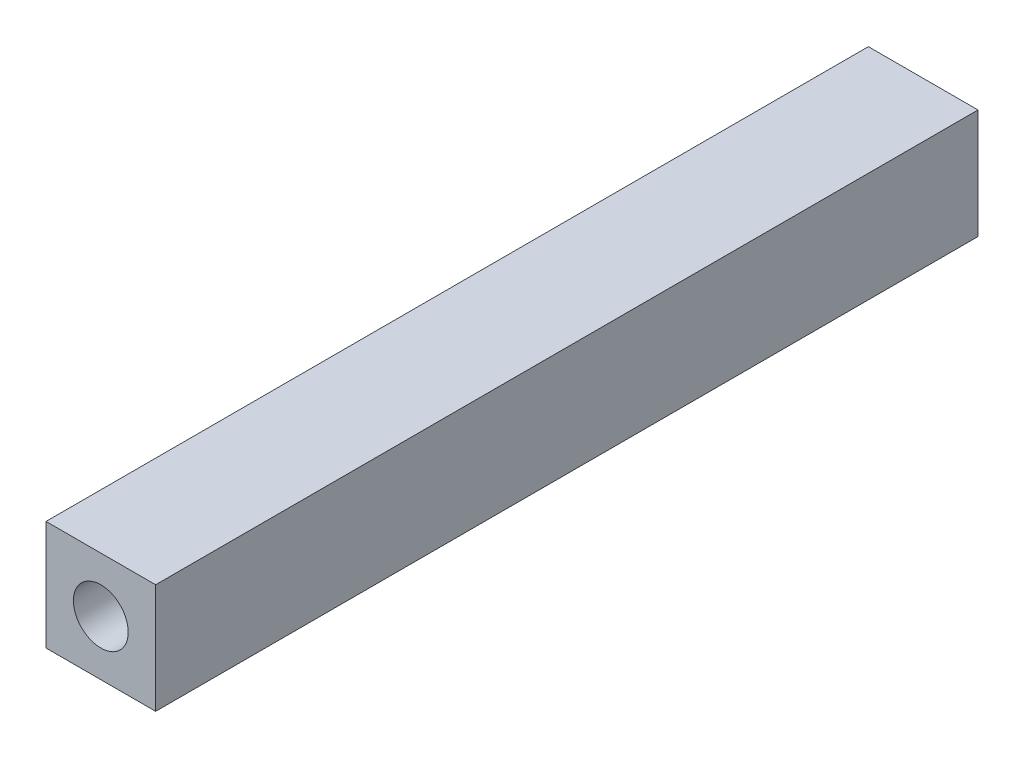
ISO-10303-21;
HEADER;
FILE_DESCRIPTION(('STEP AP214'),'2;1');
FILE_NAME('part.step','',(''),(''),'','','');
FILE_SCHEMA(('AUTOMOTIVE_DESIGN { 1 0 10303 214 1 1 1 1 }'));
ENDSEC;
DATA;
#1=APPLICATION_CONTEXT('core data for automotive mechanical design processes');
#2=APPLICATION_PROTOCOL_DEFINITION('international standard','automotive_design',2000,#1);
#3=PRODUCT_CONTEXT('',#1,'mechanical');
#4=PRODUCT('Part','Part','',(#3));
#5=PRODUCT_RELATED_PRODUCT_CATEGORY('part','',(#4));
#6=PRODUCT_DEFINITION_FORMATION('','',#4);
#7=PRODUCT_DEFINITION_CONTEXT('part definition',#1,'design');
#8=PRODUCT_DEFINITION('design','',#6,#7);
#9=PRODUCT_DEFINITION_SHAPE('','',#8);
#10=(LENGTH_UNIT() NAMED_UNIT(*) SI_UNIT(.MILLI.,.METRE.));
#11=(NAMED_UNIT(*) PLANE_ANGLE_UNIT() SI_UNIT($,.RADIAN.));
#12=(NAMED_UNIT(*) SI_UNIT($,.STERADIAN.) SOLID_ANGLE_UNIT());
#13=UNCERTAINTY_MEASURE_WITH_UNIT(LENGTH_MEASURE(1.E-05),#10,'distance_accuracy_value','');
#14=(GEOMETRIC_REPRESENTATION_CONTEXT(3) GLOBAL_UNCERTAINTY_ASSIGNED_CONTEXT((#13)) GLOBAL_UNIT_ASSIGNED_CONTEXT((#10,
#11,#12)) REPRESENTATION_CONTEXT('',''));
#15=CARTESIAN_POINT('',(0.,0.,0.));
#16=DIRECTION('',(0.,0.,1.));
#17=DIRECTION('',(1.,0.,0.));
#18=AXIS2_PLACEMENT_3D('',#15,#16,#17);
#19=CARTESIAN_POINT('',(0.,0.,150.));
#20=DIRECTION('',(0.,0.,-1.));
#21=DIRECTION('',(-1.,0.,0.));
#22=AXIS2_PLACEMENT_3D('',#19,#20,#21);
#23=PLANE('',#22);
#24=DIRECTION('',(0.,1.,0.));
#25=VECTOR('',#24,1.);
#26=CARTESIAN_POINT('',(10.,-10.,150.));
#27=LINE('',#26,#25);
#28=CARTESIAN_POINT('',(10.,-10.,150.));
#29=VERTEX_POINT('',#28);
#30=CARTESIAN_POINT('',(10.,10.,150.));
#31=VERTEX_POINT('',#30);
#32=EDGE_CURVE('E92',#29,#31,#27,.T.);
#33=ORIENTED_EDGE('',*,*,#32,.T.);
#34=DIRECTION('',(-1.,0.,0.));
#35=VECTOR('',#34,1.);
#36=CARTESIAN_POINT('',(-10.,10.,150.));
#37=LINE('',#36,#35);
#38=CARTESIAN_POINT('',(-10.,10.,150.));
#39=VERTEX_POINT('',#38);
#40=EDGE_CURVE('E87',#31,#39,#37,.T.);
#41=ORIENTED_EDGE('',*,*,#40,.T.);
#42=DIRECTION('',(0.,-1.,0.));
#43=VECTOR('',#42,1.);
#44=CARTESIAN_POINT('',(-10.,-10.,150.));
#45=LINE('',#44,#43);
#46=CARTESIAN_POINT('',(-10.,-10.,150.));
#47=VERTEX_POINT('',#46);
#48=EDGE_CURVE('E90',#39,#47,#45,.T.);
#49=ORIENTED_EDGE('',*,*,#48,.T.);
#50=DIRECTION('',(1.,0.,0.));
#51=VECTOR('',#50,1.);
#52=CARTESIAN_POINT('',(-10.,-10.,150.));
#53=LINE('',#52,#51);
#54=EDGE_CURVE('E57',#47,#29,#53,.T.);
#55=ORIENTED_EDGE('',*,*,#54,.T.);
#56=EDGE_LOOP('',(#33,#41,#49,#55));
#57=FACE_BOUND('',#56,.T.);
#58=CARTESIAN_POINT('',(0.,0.,150.));
#59=DIRECTION('',(0.,0.,1.));
#60=DIRECTION('',(1.,0.,0.));
#61=AXIS2_PLACEMENT_3D('',#58,#59,#60);
#62=CIRCLE('',#61,5.);
#63=CARTESIAN_POINT('',(5.,0.,150.));
#64=VERTEX_POINT('',#63);
#65=EDGE_CURVE('E112',#64,#64,#62,.T.);
#66=ORIENTED_EDGE('',*,*,#65,.F.);
#67=EDGE_LOOP('',(#66));
#68=FACE_BOUND('',#67,.T.);
#69=ADVANCED_FACE('F39',(#57,#68),#23,.F.);
#70=CARTESIAN_POINT('',(0.,0.,0.));
#71=DIRECTION('',(0.,0.,-1.));
#72=DIRECTION('',(-1.,0.,0.));
#73=AXIS2_PLACEMENT_3D('',#70,#71,#72);
#74=PLANE('',#73);
#75=DIRECTION('',(0.,1.,0.));
#76=VECTOR('',#75,1.);
#77=CARTESIAN_POINT('',(10.,-10.,0.));
#78=LINE('',#77,#76);
#79=CARTESIAN_POINT('',(10.,-10.,0.));
#80=VERTEX_POINT('',#79);
#81=CARTESIAN_POINT('',(10.,10.,0.));
#82=VERTEX_POINT('',#81);
#83=EDGE_CURVE('E108',#80,#82,#78,.T.);
#84=ORIENTED_EDGE('',*,*,#83,.F.);
#85=DIRECTION('',(1.,0.,0.));
#86=VECTOR('',#85,1.);
#87=CARTESIAN_POINT('',(-10.,-10.,0.));
#88=LINE('',#87,#86);
#89=CARTESIAN_POINT('',(-10.,-10.,0.));
#90=VERTEX_POINT('',#89);
#91=EDGE_CURVE('E80',#90,#80,#88,.T.);
#92=ORIENTED_EDGE('',*,*,#91,.F.);
#93=DIRECTION('',(0.,-1.,0.));
#94=VECTOR('',#93,1.);
#95=CARTESIAN_POINT('',(-10.,-10.,0.));
#96=LINE('',#95,#94);
#97=CARTESIAN_POINT('',(-10.,10.,0.));
#98=VERTEX_POINT('',#97);
#99=EDGE_CURVE('E74',#98,#90,#96,.T.);
#100=ORIENTED_EDGE('',*,*,#99,.F.);
#101=DIRECTION('',(-1.,0.,0.));
#102=VECTOR('',#101,1.);
#103=CARTESIAN_POINT('',(-10.,10.,0.));
#104=LINE('',#103,#102);
#105=EDGE_CURVE('E97',#82,#98,#104,.T.);
#106=ORIENTED_EDGE('',*,*,#105,.F.);
#107=EDGE_LOOP('',(#84,#92,#100,#106));
#108=FACE_BOUND('',#107,.T.);
#109=CARTESIAN_POINT('',(0.,0.,0.));
#110=DIRECTION('',(0.,0.,1.));
#111=DIRECTION('',(1.,0.,0.));
#112=AXIS2_PLACEMENT_3D('',#109,#110,#111);
#113=CIRCLE('',#112,5.);
#114=CARTESIAN_POINT('',(5.,0.,0.));
#115=VERTEX_POINT('',#114);
#116=EDGE_CURVE('E130',#115,#115,#113,.T.);
#117=ORIENTED_EDGE('',*,*,#116,.T.);
#118=EDGE_LOOP('',(#117));
#119=FACE_BOUND('',#118,.T.);
#120=ADVANCED_FACE('F125',(#108,#119),#74,.T.);
#121=CARTESIAN_POINT('',(10.,-10.,150.));
#122=DIRECTION('',(-1.,0.,0.));
#123=DIRECTION('',(0.,0.,1.));
#124=AXIS2_PLACEMENT_3D('',#121,#122,#123);
#125=PLANE('',#124);
#126=ORIENTED_EDGE('',*,*,#83,.T.);
#127=DIRECTION('',(0.,0.,-1.));
#128=VECTOR('',#127,1.);
#129=CARTESIAN_POINT('',(10.,10.,150.));
#130=LINE('',#129,#128);
#131=EDGE_CURVE('E11',#31,#82,#130,.T.);
#132=ORIENTED_EDGE('',*,*,#131,.F.);
#133=ORIENTED_EDGE('',*,*,#32,.F.);
#134=DIRECTION('',(0.,0.,-1.));
#135=VECTOR('',#134,1.);
#136=CARTESIAN_POINT('',(10.,-10.,150.));
#137=LINE('',#136,#135);
#138=EDGE_CURVE('E104',#29,#80,#137,.T.);
#139=ORIENTED_EDGE('',*,*,#138,.T.);
#140=EDGE_LOOP('',(#126,#132,#133,#139));
#141=FACE_BOUND('',#140,.T.);
#142=ADVANCED_FACE('F41',(#141),#125,.F.);
#143=CARTESIAN_POINT('',(-10.,10.,150.));
#144=DIRECTION('',(0.,-1.,0.));
#145=DIRECTION('',(0.,0.,-1.));
#146=AXIS2_PLACEMENT_3D('',#143,#144,#145);
#147=PLANE('',#146);
#148=ORIENTED_EDGE('',*,*,#105,.T.);
#149=DIRECTION('',(0.,0.,-1.));
#150=VECTOR('',#149,1.);
#151=CARTESIAN_POINT('',(-10.,10.,150.));
#152=LINE('',#151,#150);
#153=EDGE_CURVE('E49',#39,#98,#152,.T.);
#154=ORIENTED_EDGE('',*,*,#153,.F.);
#155=ORIENTED_EDGE('',*,*,#40,.F.);
#156=ORIENTED_EDGE('',*,*,#131,.T.);
#157=EDGE_LOOP('',(#148,#154,#155,#156));
#158=FACE_BOUND('',#157,.T.);
#159=ADVANCED_FACE('F96',(#158),#147,.F.);
#160=CARTESIAN_POINT('',(-10.,-10.,150.));
#161=DIRECTION('',(1.,0.,0.));
#162=DIRECTION('',(0.,0.,-1.));
#163=AXIS2_PLACEMENT_3D('',#160,#161,#162);
#164=PLANE('',#163);
#165=ORIENTED_EDGE('',*,*,#99,.T.);
#166=DIRECTION('',(0.,0.,-1.));
#167=VECTOR('',#166,1.);
#168=CARTESIAN_POINT('',(-10.,-10.,150.));
#169=LINE('',#168,#167);
#170=EDGE_CURVE('E99',#47,#90,#169,.T.);
#171=ORIENTED_EDGE('',*,*,#170,.F.);
#172=ORIENTED_EDGE('',*,*,#48,.F.);
#173=ORIENTED_EDGE('',*,*,#153,.T.);
#174=EDGE_LOOP('',(#165,#171,#172,#173));
#175=FACE_BOUND('',#174,.T.);
#176=ADVANCED_FACE('F100',(#175),#164,.F.);
#177=CARTESIAN_POINT('',(-10.,-10.,150.));
#178=DIRECTION('',(0.,1.,0.));
#179=DIRECTION('',(0.,0.,1.));
#180=AXIS2_PLACEMENT_3D('',#177,#178,#179);
#181=PLANE('',#180);
#182=ORIENTED_EDGE('',*,*,#91,.T.);
#183=ORIENTED_EDGE('',*,*,#138,.F.);
#184=ORIENTED_EDGE('',*,*,#54,.F.);
#185=ORIENTED_EDGE('',*,*,#170,.T.);
#186=EDGE_LOOP('',(#182,#183,#184,#185));
#187=FACE_BOUND('',#186,.T.);
#188=ADVANCED_FACE('F122',(#187),#181,.F.);
#189=CARTESIAN_POINT('',(0.,0.,150.));
#190=DIRECTION('',(0.,0.,-1.));
#191=DIRECTION('',(-1.,0.,0.));
#192=AXIS2_PLACEMENT_3D('',#189,#190,#191);
#193=CYLINDRICAL_SURFACE('',#192,5.);
#194=ORIENTED_EDGE('',*,*,#65,.T.);
#195=EDGE_LOOP('',(#194));
#196=FACE_BOUND('',#195,.T.);
#197=ORIENTED_EDGE('',*,*,#116,.F.);
#198=EDGE_LOOP('',(#197));
#199=FACE_BOUND('',#198,.T.);
#200=ADVANCED_FACE('F138',(#196,#199),#193,.F.);
#201=CLOSED_SHELL('',(#69,#120,#142,#159,#176,#188,#200));
#202=MANIFOLD_SOLID_BREP('B2',#201);
#203=ADVANCED_BREP_SHAPE_REPRESENTATION('',(#18,#202),#14);
#204=SHAPE_DEFINITION_REPRESENTATION(#9,#203);
ENDSEC;
END-ISO-10303-21;
